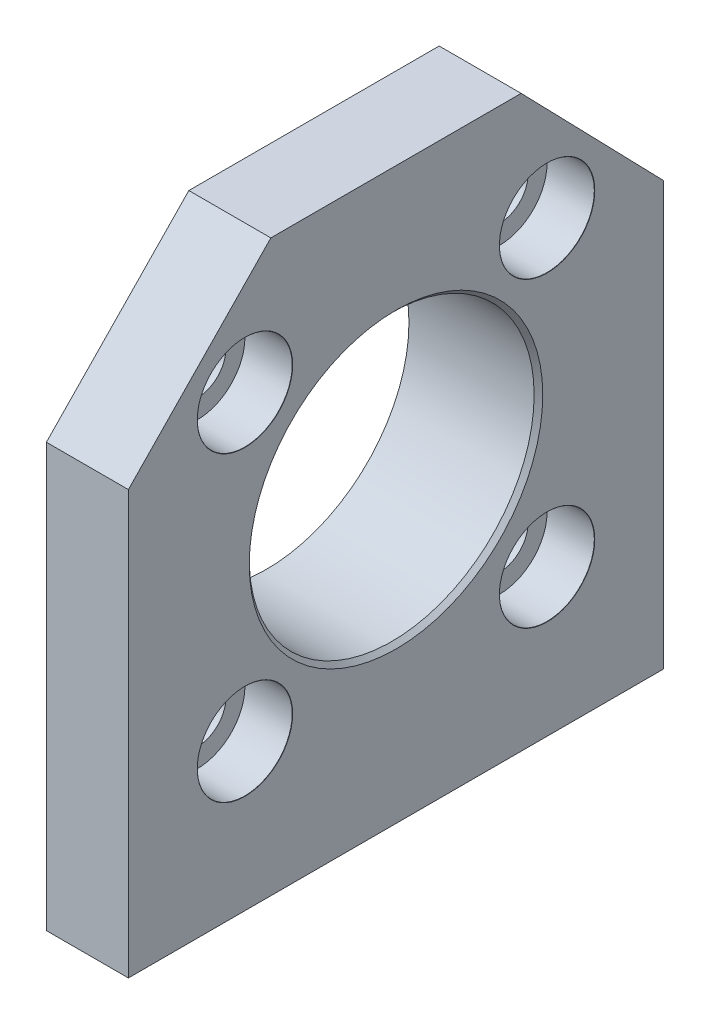
ISO-10303-21;
HEADER;
FILE_DESCRIPTION(('STEP AP214'),'2;1');
FILE_NAME('part.step','',(''),(''),'','','');
FILE_SCHEMA(('AUTOMOTIVE_DESIGN { 1 0 10303 214 1 1 1 1 }'));
ENDSEC;
DATA;
#1=APPLICATION_CONTEXT('core data for automotive mechanical design processes');
#2=APPLICATION_PROTOCOL_DEFINITION('international standard','automotive_design',2000,#1);
#3=PRODUCT_CONTEXT('',#1,'mechanical');
#4=PRODUCT('Part','Part','',(#3));
#5=PRODUCT_RELATED_PRODUCT_CATEGORY('part','',(#4));
#6=PRODUCT_DEFINITION_FORMATION('','',#4);
#7=PRODUCT_DEFINITION_CONTEXT('part definition',#1,'design');
#8=PRODUCT_DEFINITION('design','',#6,#7);
#9=PRODUCT_DEFINITION_SHAPE('','',#8);
#10=(LENGTH_UNIT() NAMED_UNIT(*) SI_UNIT(.MILLI.,.METRE.));
#11=(NAMED_UNIT(*) PLANE_ANGLE_UNIT() SI_UNIT($,.RADIAN.));
#12=(NAMED_UNIT(*) SI_UNIT($,.STERADIAN.) SOLID_ANGLE_UNIT());
#13=UNCERTAINTY_MEASURE_WITH_UNIT(LENGTH_MEASURE(1.E-05),#10,'distance_accuracy_value','');
#14=(GEOMETRIC_REPRESENTATION_CONTEXT(3) GLOBAL_UNCERTAINTY_ASSIGNED_CONTEXT((#13)) GLOBAL_UNIT_ASSIGNED_CONTEXT((#10,
#11,#12)) REPRESENTATION_CONTEXT('',''));
#15=CARTESIAN_POINT('',(0.,0.,0.));
#16=DIRECTION('',(0.,0.,1.));
#17=DIRECTION('',(1.,0.,0.));
#18=AXIS2_PLACEMENT_3D('',#15,#16,#17);
#19=CARTESIAN_POINT('',(-9.5,23.7688195991091,24.4890868596882));
#20=DIRECTION('',(0.,-0.69647537716866,-0.717580691628316));
#21=DIRECTION('',(0.,0.717580691628316,-0.69647537716866));
#22=AXIS2_PLACEMENT_3D('',#19,#20,#21);
#23=PLANE('',#22);
#24=DIRECTION('',(0.,0.717580691628316,-0.69647537716866));
#25=VECTOR('',#24,1.);
#26=CARTESIAN_POINT('',(0.,23.7688195991091,24.4890868596882));
#27=LINE('',#26,#25);
#28=CARTESIAN_POINT('',(0.,49.,0.));
#29=VERTEX_POINT('',#28);
#30=CARTESIAN_POINT('',(0.,66.,-16.5));
#31=VERTEX_POINT('',#30);
#32=EDGE_CURVE('E128',#29,#31,#27,.T.);
#33=ORIENTED_EDGE('',*,*,#32,.T.);
#34=DIRECTION('',(1.,0.,0.));
#35=VECTOR('',#34,1.);
#36=CARTESIAN_POINT('',(-9.5,66.,-16.5));
#37=LINE('',#36,#35);
#38=CARTESIAN_POINT('',(-9.5,66.,-16.5));
#39=VERTEX_POINT('',#38);
#40=EDGE_CURVE('E142',#39,#31,#37,.T.);
#41=ORIENTED_EDGE('',*,*,#40,.F.);
#42=DIRECTION('',(0.,0.717580691628316,-0.69647537716866));
#43=VECTOR('',#42,1.);
#44=CARTESIAN_POINT('',(-9.5,23.7688195991091,24.4890868596882));
#45=LINE('',#44,#43);
#46=CARTESIAN_POINT('',(-9.5,49.,0.));
#47=VERTEX_POINT('',#46);
#48=EDGE_CURVE('E141',#47,#39,#45,.T.);
#49=ORIENTED_EDGE('',*,*,#48,.F.);
#50=DIRECTION('',(1.,0.,0.));
#51=VECTOR('',#50,1.);
#52=CARTESIAN_POINT('',(-9.5,49.,0.));
#53=LINE('',#52,#51);
#54=EDGE_CURVE('E127',#47,#29,#53,.T.);
#55=ORIENTED_EDGE('',*,*,#54,.T.);
#56=EDGE_LOOP('',(#33,#41,#49,#55));
#57=FACE_BOUND('',#56,.T.);
#58=ADVANCED_FACE('F42',(#57),#23,.F.);
#59=CARTESIAN_POINT('',(-9.5,66.,0.));
#60=DIRECTION('',(0.,-1.,0.));
#61=DIRECTION('',(0.,0.,-1.));
#62=AXIS2_PLACEMENT_3D('',#59,#60,#61);
#63=PLANE('',#62);
#64=DIRECTION('',(0.,0.,-1.));
#65=VECTOR('',#64,1.);
#66=CARTESIAN_POINT('',(0.,66.,0.));
#67=LINE('',#66,#65);
#68=CARTESIAN_POINT('',(0.,66.,-45.5));
#69=VERTEX_POINT('',#68);
#70=EDGE_CURVE('E80',#31,#69,#67,.T.);
#71=ORIENTED_EDGE('',*,*,#70,.T.);
#72=DIRECTION('',(1.,0.,0.));
#73=VECTOR('',#72,1.);
#74=CARTESIAN_POINT('',(-9.5,66.,-45.5));
#75=LINE('',#74,#73);
#76=CARTESIAN_POINT('',(-9.5,66.,-45.5));
#77=VERTEX_POINT('',#76);
#78=EDGE_CURVE('E117',#77,#69,#75,.T.);
#79=ORIENTED_EDGE('',*,*,#78,.F.);
#80=DIRECTION('',(0.,0.,-1.));
#81=VECTOR('',#80,1.);
#82=CARTESIAN_POINT('',(-9.5,66.,0.));
#83=LINE('',#82,#81);
#84=EDGE_CURVE('E60',#39,#77,#83,.T.);
#85=ORIENTED_EDGE('',*,*,#84,.F.);
#86=ORIENTED_EDGE('',*,*,#40,.T.);
#87=EDGE_LOOP('',(#71,#79,#85,#86));
#88=FACE_BOUND('',#87,.T.);
#89=ADVANCED_FACE('F167',(#88),#63,.F.);
#90=CARTESIAN_POINT('',(-9.5,54.7550111358575,-56.4142538975501));
#91=DIRECTION('',(0.,-0.69647537716866,0.717580691628316));
#92=DIRECTION('',(0.,-0.717580691628316,-0.69647537716866));
#93=AXIS2_PLACEMENT_3D('',#90,#91,#92);
#94=PLANE('',#93);
#95=DIRECTION('',(0.,-0.717580691628316,-0.69647537716866));
#96=VECTOR('',#95,1.);
#97=CARTESIAN_POINT('',(0.,54.7550111358575,-56.4142538975501));
#98=LINE('',#97,#96);
#99=CARTESIAN_POINT('',(0.,49.,-62.));
#100=VERTEX_POINT('',#99);
#101=EDGE_CURVE('E113',#69,#100,#98,.T.);
#102=ORIENTED_EDGE('',*,*,#101,.T.);
#103=DIRECTION('',(1.,0.,0.));
#104=VECTOR('',#103,1.);
#105=CARTESIAN_POINT('',(-9.5,49.,-62.));
#106=LINE('',#105,#104);
#107=CARTESIAN_POINT('',(-9.5,49.,-62.));
#108=VERTEX_POINT('',#107);
#109=EDGE_CURVE('E111',#108,#100,#106,.T.);
#110=ORIENTED_EDGE('',*,*,#109,.F.);
#111=DIRECTION('',(0.,-0.717580691628316,-0.69647537716866));
#112=VECTOR('',#111,1.);
#113=CARTESIAN_POINT('',(-9.5,54.7550111358575,-56.4142538975501));
#114=LINE('',#113,#112);
#115=EDGE_CURVE('E102',#77,#108,#114,.T.);
#116=ORIENTED_EDGE('',*,*,#115,.F.);
#117=ORIENTED_EDGE('',*,*,#78,.T.);
#118=EDGE_LOOP('',(#102,#110,#116,#117));
#119=FACE_BOUND('',#118,.T.);
#120=ADVANCED_FACE('F112',(#119),#94,.F.);
#121=CARTESIAN_POINT('',(-9.5,0.,-62.));
#122=DIRECTION('',(0.,0.,-1.));
#123=DIRECTION('',(-1.,0.,0.));
#124=AXIS2_PLACEMENT_3D('',#121,#122,#123);
#125=PLANE('',#124);
#126=DIRECTION('',(0.,1.,0.));
#127=VECTOR('',#126,1.);
#128=CARTESIAN_POINT('',(0.,0.,-62.));
#129=LINE('',#128,#127);
#130=CARTESIAN_POINT('',(0.,0.,-62.));
#131=VERTEX_POINT('',#130);
#132=EDGE_CURVE('E137',#131,#100,#129,.T.);
#133=ORIENTED_EDGE('',*,*,#132,.F.);
#134=DIRECTION('',(1.,0.,0.));
#135=VECTOR('',#134,1.);
#136=CARTESIAN_POINT('',(-9.5,0.,-62.));
#137=LINE('',#136,#135);
#138=CARTESIAN_POINT('',(-9.5,0.,-62.));
#139=VERTEX_POINT('',#138);
#140=EDGE_CURVE('E118',#139,#131,#137,.T.);
#141=ORIENTED_EDGE('',*,*,#140,.F.);
#142=DIRECTION('',(0.,1.,0.));
#143=VECTOR('',#142,1.);
#144=CARTESIAN_POINT('',(-9.5,0.,-62.));
#145=LINE('',#144,#143);
#146=EDGE_CURVE('E106',#139,#108,#145,.T.);
#147=ORIENTED_EDGE('',*,*,#146,.T.);
#148=ORIENTED_EDGE('',*,*,#109,.T.);
#149=EDGE_LOOP('',(#133,#141,#147,#148));
#150=FACE_BOUND('',#149,.T.);
#151=ADVANCED_FACE('F120',(#150),#125,.T.);
#152=CARTESIAN_POINT('',(-9.5,0.,0.));
#153=DIRECTION('',(0.,-1.,0.));
#154=DIRECTION('',(0.,0.,-1.));
#155=AXIS2_PLACEMENT_3D('',#152,#153,#154);
#156=PLANE('',#155);
#157=DIRECTION('',(0.,0.,-1.));
#158=VECTOR('',#157,1.);
#159=CARTESIAN_POINT('',(0.,0.,0.));
#160=LINE('',#159,#158);
#161=CARTESIAN_POINT('',(0.,0.,0.));
#162=VERTEX_POINT('',#161);
#163=EDGE_CURVE('E134',#162,#131,#160,.T.);
#164=ORIENTED_EDGE('',*,*,#163,.F.);
#165=DIRECTION('',(1.,0.,0.));
#166=VECTOR('',#165,1.);
#167=CARTESIAN_POINT('',(-9.5,0.,0.));
#168=LINE('',#167,#166);
#169=CARTESIAN_POINT('',(-9.5,0.,0.));
#170=VERTEX_POINT('',#169);
#171=EDGE_CURVE('E147',#170,#162,#168,.T.);
#172=ORIENTED_EDGE('',*,*,#171,.F.);
#173=DIRECTION('',(0.,0.,-1.));
#174=VECTOR('',#173,1.);
#175=CARTESIAN_POINT('',(-9.5,0.,0.));
#176=LINE('',#175,#174);
#177=EDGE_CURVE('E121',#170,#139,#176,.T.);
#178=ORIENTED_EDGE('',*,*,#177,.T.);
#179=ORIENTED_EDGE('',*,*,#140,.T.);
#180=EDGE_LOOP('',(#164,#172,#178,#179));
#181=FACE_BOUND('',#180,.T.);
#182=ADVANCED_FACE('F177',(#181),#156,.T.);
#183=CARTESIAN_POINT('',(-9.5,0.,0.));
#184=DIRECTION('',(0.,0.,-1.));
#185=DIRECTION('',(-1.,0.,0.));
#186=AXIS2_PLACEMENT_3D('',#183,#184,#185);
#187=PLANE('',#186);
#188=DIRECTION('',(0.,1.,0.));
#189=VECTOR('',#188,1.);
#190=CARTESIAN_POINT('',(0.,0.,0.));
#191=LINE('',#190,#189);
#192=EDGE_CURVE('E131',#162,#29,#191,.T.);
#193=ORIENTED_EDGE('',*,*,#192,.T.);
#194=ORIENTED_EDGE('',*,*,#54,.F.);
#195=DIRECTION('',(0.,1.,0.));
#196=VECTOR('',#195,1.);
#197=CARTESIAN_POINT('',(-9.5,0.,0.));
#198=LINE('',#197,#196);
#199=EDGE_CURVE('E92',#170,#47,#198,.T.);
#200=ORIENTED_EDGE('',*,*,#199,.F.);
#201=ORIENTED_EDGE('',*,*,#171,.T.);
#202=EDGE_LOOP('',(#193,#194,#200,#201));
#203=FACE_BOUND('',#202,.T.);
#204=ADVANCED_FACE('F174',(#203),#187,.F.);
#205=CARTESIAN_POINT('',(-9.5,0.,0.));
#206=DIRECTION('',(1.,0.,0.));
#207=DIRECTION('',(0.,0.,-1.));
#208=AXIS2_PLACEMENT_3D('',#205,#206,#207);
#209=PLANE('',#208);
#210=CARTESIAN_POINT('',(-9.5,34.5,-31.));
#211=DIRECTION('',(1.,0.,0.));
#212=DIRECTION('',(0.,0.,-1.));
#213=AXIS2_PLACEMENT_3D('',#210,#211,#212);
#214=CIRCLE('',#213,19.9);
#215=CARTESIAN_POINT('',(-9.5,34.5,-50.9));
#216=VERTEX_POINT('',#215);
#217=EDGE_CURVE('E144',#216,#216,#214,.F.);
#218=ORIENTED_EDGE('',*,*,#217,.F.);
#219=EDGE_LOOP('',(#218));
#220=FACE_BOUND('',#219,.T.);
#221=CARTESIAN_POINT('',(-9.49999999999999,52.,-13.5));
#222=DIRECTION('',(1.,0.,0.));
#223=DIRECTION('',(0.,0.,-1.));
#224=AXIS2_PLACEMENT_3D('',#221,#222,#223);
#225=CIRCLE('',#224,3.3);
#226=CARTESIAN_POINT('',(-9.49999999999999,52.,-16.8));
#227=VERTEX_POINT('',#226);
#228=EDGE_CURVE('E287',#227,#227,#225,.T.);
#229=ORIENTED_EDGE('',*,*,#228,.T.);
#230=EDGE_LOOP('',(#229));
#231=FACE_BOUND('',#230,.T.);
#232=CARTESIAN_POINT('',(-9.49999999999999,52.,-48.5));
#233=DIRECTION('',(1.,0.,0.));
#234=DIRECTION('',(0.,0.,-1.));
#235=AXIS2_PLACEMENT_3D('',#232,#233,#234);
#236=CIRCLE('',#235,3.3);
#237=CARTESIAN_POINT('',(-9.49999999999999,52.,-51.8));
#238=VERTEX_POINT('',#237);
#239=EDGE_CURVE('E302',#238,#238,#236,.T.);
#240=ORIENTED_EDGE('',*,*,#239,.T.);
#241=EDGE_LOOP('',(#240));
#242=FACE_BOUND('',#241,.T.);
#243=CARTESIAN_POINT('',(-9.49999999999999,17.,-48.5));
#244=DIRECTION('',(1.,0.,0.));
#245=DIRECTION('',(0.,0.,-1.));
#246=AXIS2_PLACEMENT_3D('',#243,#244,#245);
#247=CIRCLE('',#246,3.30000000000001);
#248=CARTESIAN_POINT('',(-9.49999999999999,17.,-51.8));
#249=VERTEX_POINT('',#248);
#250=EDGE_CURVE('E317',#249,#249,#247,.T.);
#251=ORIENTED_EDGE('',*,*,#250,.T.);
#252=EDGE_LOOP('',(#251));
#253=FACE_BOUND('',#252,.T.);
#254=CARTESIAN_POINT('',(-9.49999999999999,17.,-13.5));
#255=DIRECTION('',(1.,0.,0.));
#256=DIRECTION('',(0.,0.,-1.));
#257=AXIS2_PLACEMENT_3D('',#254,#255,#256);
#258=CIRCLE('',#257,3.30000000000001);
#259=CARTESIAN_POINT('',(-9.49999999999999,17.,-16.8));
#260=VERTEX_POINT('',#259);
#261=EDGE_CURVE('E132',#260,#260,#258,.T.);
#262=ORIENTED_EDGE('',*,*,#261,.T.);
#263=EDGE_LOOP('',(#262));
#264=FACE_BOUND('',#263,.T.);
#265=ORIENTED_EDGE('',*,*,#48,.T.);
#266=ORIENTED_EDGE('',*,*,#84,.T.);
#267=ORIENTED_EDGE('',*,*,#115,.T.);
#268=ORIENTED_EDGE('',*,*,#146,.F.);
#269=ORIENTED_EDGE('',*,*,#177,.F.);
#270=ORIENTED_EDGE('',*,*,#199,.T.);
#271=EDGE_LOOP('',(#265,#266,#267,#268,#269,#270));
#272=FACE_BOUND('',#271,.T.);
#273=ADVANCED_FACE('F104',(#220,#231,#242,#253,#264,#272),#209,.F.);
#274=CARTESIAN_POINT('',(0.,0.,0.));
#275=DIRECTION('',(1.,0.,0.));
#276=DIRECTION('',(0.,0.,-1.));
#277=AXIS2_PLACEMENT_3D('',#274,#275,#276);
#278=PLANE('',#277);
#279=CARTESIAN_POINT('',(0.,34.5,-31.));
#280=DIRECTION('',(1.,0.,0.));
#281=DIRECTION('',(0.,0.,-1.));
#282=AXIS2_PLACEMENT_3D('',#279,#280,#281);
#283=CIRCLE('',#282,17.);
#284=CARTESIAN_POINT('',(0.,34.5,-48.));
#285=VERTEX_POINT('',#284);
#286=EDGE_CURVE('E11',#285,#285,#283,.F.);
#287=ORIENTED_EDGE('',*,*,#286,.T.);
#288=EDGE_LOOP('',(#287));
#289=FACE_BOUND('',#288,.T.);
#290=CARTESIAN_POINT('',(0.,52.,-13.5));
#291=DIRECTION('',(1.,0.,0.));
#292=DIRECTION('',(0.,0.,-1.));
#293=AXIS2_PLACEMENT_3D('',#290,#291,#292);
#294=CIRCLE('',#293,5.525);
#295=CARTESIAN_POINT('',(0.,52.,-19.025));
#296=VERTEX_POINT('',#295);
#297=EDGE_CURVE('E272',#296,#296,#294,.T.);
#298=ORIENTED_EDGE('',*,*,#297,.F.);
#299=EDGE_LOOP('',(#298));
#300=FACE_BOUND('',#299,.T.);
#301=CARTESIAN_POINT('',(0.,52.,-48.5));
#302=DIRECTION('',(1.,0.,0.));
#303=DIRECTION('',(0.,0.,-1.));
#304=AXIS2_PLACEMENT_3D('',#301,#302,#303);
#305=CIRCLE('',#304,5.525);
#306=CARTESIAN_POINT('',(0.,52.,-54.025));
#307=VERTEX_POINT('',#306);
#308=EDGE_CURVE('E290',#307,#307,#305,.T.);
#309=ORIENTED_EDGE('',*,*,#308,.F.);
#310=EDGE_LOOP('',(#309));
#311=FACE_BOUND('',#310,.T.);
#312=CARTESIAN_POINT('',(0.,17.,-48.5));
#313=DIRECTION('',(1.,0.,0.));
#314=DIRECTION('',(0.,0.,-1.));
#315=AXIS2_PLACEMENT_3D('',#312,#313,#314);
#316=CIRCLE('',#315,5.525);
#317=CARTESIAN_POINT('',(0.,17.,-54.025));
#318=VERTEX_POINT('',#317);
#319=EDGE_CURVE('E305',#318,#318,#316,.T.);
#320=ORIENTED_EDGE('',*,*,#319,.F.);
#321=EDGE_LOOP('',(#320));
#322=FACE_BOUND('',#321,.T.);
#323=CARTESIAN_POINT('',(0.,17.,-13.5));
#324=DIRECTION('',(1.,0.,0.));
#325=DIRECTION('',(0.,0.,-1.));
#326=AXIS2_PLACEMENT_3D('',#323,#324,#325);
#327=CIRCLE('',#326,5.525);
#328=CARTESIAN_POINT('',(0.,17.,-19.025));
#329=VERTEX_POINT('',#328);
#330=EDGE_CURVE('E320',#329,#329,#327,.T.);
#331=ORIENTED_EDGE('',*,*,#330,.F.);
#332=EDGE_LOOP('',(#331));
#333=FACE_BOUND('',#332,.T.);
#334=ORIENTED_EDGE('',*,*,#32,.F.);
#335=ORIENTED_EDGE('',*,*,#192,.F.);
#336=ORIENTED_EDGE('',*,*,#163,.T.);
#337=ORIENTED_EDGE('',*,*,#132,.T.);
#338=ORIENTED_EDGE('',*,*,#101,.F.);
#339=ORIENTED_EDGE('',*,*,#70,.F.);
#340=EDGE_LOOP('',(#334,#335,#336,#337,#338,#339));
#341=FACE_BOUND('',#340,.T.);
#342=ADVANCED_FACE('F186',(#289,#300,#311,#322,#333,#341),#278,.T.);
#343=CARTESIAN_POINT('',(0.,17.,-13.5));
#344=DIRECTION('',(1.,0.,0.));
#345=DIRECTION('',(0.,0.,-1.));
#346=AXIS2_PLACEMENT_3D('',#343,#344,#345);
#347=CYLINDRICAL_SURFACE('',#346,3.3);
#348=ORIENTED_EDGE('',*,*,#261,.F.);
#349=EDGE_LOOP('',(#348));
#350=FACE_BOUND('',#349,.T.);
#351=CARTESIAN_POINT('',(-5.5,17.,-13.5));
#352=DIRECTION('',(1.,0.,0.));
#353=DIRECTION('',(0.,0.,-1.));
#354=AXIS2_PLACEMENT_3D('',#351,#352,#353);
#355=CIRCLE('',#354,3.3);
#356=CARTESIAN_POINT('',(-5.5,17.,-16.8));
#357=VERTEX_POINT('',#356);
#358=EDGE_CURVE('E329',#357,#357,#355,.T.);
#359=ORIENTED_EDGE('',*,*,#358,.T.);
#360=EDGE_LOOP('',(#359));
#361=FACE_BOUND('',#360,.T.);
#362=ADVANCED_FACE('F189',(#350,#361),#347,.F.);
#363=CARTESIAN_POINT('',(-5.5,22.5,-13.5));
#364=DIRECTION('',(-1.,0.,0.));
#365=DIRECTION('',(0.,0.,1.));
#366=AXIS2_PLACEMENT_3D('',#363,#364,#365);
#367=PLANE('',#366);
#368=ORIENTED_EDGE('',*,*,#358,.F.);
#369=EDGE_LOOP('',(#368));
#370=FACE_BOUND('',#369,.T.);
#371=CARTESIAN_POINT('',(-5.5,17.,-13.5));
#372=DIRECTION('',(1.,0.,0.));
#373=DIRECTION('',(0.,0.,-1.));
#374=AXIS2_PLACEMENT_3D('',#371,#372,#373);
#375=CIRCLE('',#374,5.5);
#376=CARTESIAN_POINT('',(-5.5,17.,-19.));
#377=VERTEX_POINT('',#376);
#378=EDGE_CURVE('E326',#377,#377,#375,.T.);
#379=ORIENTED_EDGE('',*,*,#378,.T.);
#380=EDGE_LOOP('',(#379));
#381=FACE_BOUND('',#380,.T.);
#382=ADVANCED_FACE('F196',(#370,#381),#367,.F.);
#383=CARTESIAN_POINT('',(0.,17.,-13.5));
#384=DIRECTION('',(1.,0.,0.));
#385=DIRECTION('',(0.,0.,-1.));
#386=AXIS2_PLACEMENT_3D('',#383,#384,#385);
#387=CYLINDRICAL_SURFACE('',#386,5.5);
#388=ORIENTED_EDGE('',*,*,#378,.F.);
#389=EDGE_LOOP('',(#388));
#390=FACE_BOUND('',#389,.T.);
#391=CARTESIAN_POINT('',(-0.0250000000000033,17.,-13.5));
#392=DIRECTION('',(1.,0.,0.));
#393=DIRECTION('',(0.,0.,-1.));
#394=AXIS2_PLACEMENT_3D('',#391,#392,#393);
#395=CIRCLE('',#394,5.5);
#396=CARTESIAN_POINT('',(-0.0250000000000033,17.,-19.));
#397=VERTEX_POINT('',#396);
#398=EDGE_CURVE('E323',#397,#397,#395,.T.);
#399=ORIENTED_EDGE('',*,*,#398,.T.);
#400=EDGE_LOOP('',(#399));
#401=FACE_BOUND('',#400,.T.);
#402=ADVANCED_FACE('F200',(#390,#401),#387,.F.);
#403=CARTESIAN_POINT('',(0.,17.,-13.5));
#404=DIRECTION('',(1.,0.,0.));
#405=DIRECTION('',(0.,0.,-1.));
#406=AXIS2_PLACEMENT_3D('',#403,#404,#405);
#407=CONICAL_SURFACE('',#406,5.525,0.785398163397466);
#408=ORIENTED_EDGE('',*,*,#398,.F.);
#409=EDGE_LOOP('',(#408));
#410=FACE_BOUND('',#409,.T.);
#411=ORIENTED_EDGE('',*,*,#330,.T.);
#412=EDGE_LOOP('',(#411));
#413=FACE_BOUND('',#412,.T.);
#414=ADVANCED_FACE('F204',(#410,#413),#407,.F.);
#415=CARTESIAN_POINT('',(0.,17.,-48.5));
#416=DIRECTION('',(1.,0.,0.));
#417=DIRECTION('',(0.,0.,-1.));
#418=AXIS2_PLACEMENT_3D('',#415,#416,#417);
#419=CYLINDRICAL_SURFACE('',#418,3.3);
#420=ORIENTED_EDGE('',*,*,#250,.F.);
#421=EDGE_LOOP('',(#420));
#422=FACE_BOUND('',#421,.T.);
#423=CARTESIAN_POINT('',(-5.5,17.,-48.5));
#424=DIRECTION('',(1.,0.,0.));
#425=DIRECTION('',(0.,0.,-1.));
#426=AXIS2_PLACEMENT_3D('',#423,#424,#425);
#427=CIRCLE('',#426,3.3);
#428=CARTESIAN_POINT('',(-5.5,17.,-51.8));
#429=VERTEX_POINT('',#428);
#430=EDGE_CURVE('E314',#429,#429,#427,.T.);
#431=ORIENTED_EDGE('',*,*,#430,.T.);
#432=EDGE_LOOP('',(#431));
#433=FACE_BOUND('',#432,.T.);
#434=ADVANCED_FACE('F208',(#422,#433),#419,.F.);
#435=CARTESIAN_POINT('',(-5.5,22.5,-48.5));
#436=DIRECTION('',(-1.,0.,0.));
#437=DIRECTION('',(0.,0.,1.));
#438=AXIS2_PLACEMENT_3D('',#435,#436,#437);
#439=PLANE('',#438);
#440=ORIENTED_EDGE('',*,*,#430,.F.);
#441=EDGE_LOOP('',(#440));
#442=FACE_BOUND('',#441,.T.);
#443=CARTESIAN_POINT('',(-5.5,17.,-48.5));
#444=DIRECTION('',(1.,0.,0.));
#445=DIRECTION('',(0.,0.,-1.));
#446=AXIS2_PLACEMENT_3D('',#443,#444,#445);
#447=CIRCLE('',#446,5.5);
#448=CARTESIAN_POINT('',(-5.5,17.,-54.));
#449=VERTEX_POINT('',#448);
#450=EDGE_CURVE('E311',#449,#449,#447,.T.);
#451=ORIENTED_EDGE('',*,*,#450,.T.);
#452=EDGE_LOOP('',(#451));
#453=FACE_BOUND('',#452,.T.);
#454=ADVANCED_FACE('F212',(#442,#453),#439,.F.);
#455=CARTESIAN_POINT('',(0.,17.,-48.5));
#456=DIRECTION('',(1.,0.,0.));
#457=DIRECTION('',(0.,0.,-1.));
#458=AXIS2_PLACEMENT_3D('',#455,#456,#457);
#459=CYLINDRICAL_SURFACE('',#458,5.5);
#460=ORIENTED_EDGE('',*,*,#450,.F.);
#461=EDGE_LOOP('',(#460));
#462=FACE_BOUND('',#461,.T.);
#463=CARTESIAN_POINT('',(-0.0250000000000033,17.,-48.5));
#464=DIRECTION('',(1.,0.,0.));
#465=DIRECTION('',(0.,0.,-1.));
#466=AXIS2_PLACEMENT_3D('',#463,#464,#465);
#467=CIRCLE('',#466,5.5);
#468=CARTESIAN_POINT('',(-0.0250000000000033,17.,-54.));
#469=VERTEX_POINT('',#468);
#470=EDGE_CURVE('E308',#469,#469,#467,.T.);
#471=ORIENTED_EDGE('',*,*,#470,.T.);
#472=EDGE_LOOP('',(#471));
#473=FACE_BOUND('',#472,.T.);
#474=ADVANCED_FACE('F216',(#462,#473),#459,.F.);
#475=CARTESIAN_POINT('',(0.,17.,-48.5));
#476=DIRECTION('',(1.,0.,0.));
#477=DIRECTION('',(0.,0.,-1.));
#478=AXIS2_PLACEMENT_3D('',#475,#476,#477);
#479=CONICAL_SURFACE('',#478,5.525,0.785398163397466);
#480=ORIENTED_EDGE('',*,*,#470,.F.);
#481=EDGE_LOOP('',(#480));
#482=FACE_BOUND('',#481,.T.);
#483=ORIENTED_EDGE('',*,*,#319,.T.);
#484=EDGE_LOOP('',(#483));
#485=FACE_BOUND('',#484,.T.);
#486=ADVANCED_FACE('F220',(#482,#485),#479,.F.);
#487=CARTESIAN_POINT('',(0.,52.,-48.5));
#488=DIRECTION('',(1.,0.,0.));
#489=DIRECTION('',(0.,0.,-1.));
#490=AXIS2_PLACEMENT_3D('',#487,#488,#489);
#491=CYLINDRICAL_SURFACE('',#490,3.3);
#492=ORIENTED_EDGE('',*,*,#239,.F.);
#493=EDGE_LOOP('',(#492));
#494=FACE_BOUND('',#493,.T.);
#495=CARTESIAN_POINT('',(-5.5,52.,-48.5));
#496=DIRECTION('',(1.,0.,0.));
#497=DIRECTION('',(0.,0.,-1.));
#498=AXIS2_PLACEMENT_3D('',#495,#496,#497);
#499=CIRCLE('',#498,3.3);
#500=CARTESIAN_POINT('',(-5.5,52.,-51.8));
#501=VERTEX_POINT('',#500);
#502=EDGE_CURVE('E299',#501,#501,#499,.T.);
#503=ORIENTED_EDGE('',*,*,#502,.T.);
#504=EDGE_LOOP('',(#503));
#505=FACE_BOUND('',#504,.T.);
#506=ADVANCED_FACE('F224',(#494,#505),#491,.F.);
#507=CARTESIAN_POINT('',(-5.5,57.5,-48.5));
#508=DIRECTION('',(-1.,0.,0.));
#509=DIRECTION('',(0.,0.,1.));
#510=AXIS2_PLACEMENT_3D('',#507,#508,#509);
#511=PLANE('',#510);
#512=ORIENTED_EDGE('',*,*,#502,.F.);
#513=EDGE_LOOP('',(#512));
#514=FACE_BOUND('',#513,.T.);
#515=CARTESIAN_POINT('',(-5.5,52.,-48.5));
#516=DIRECTION('',(1.,0.,0.));
#517=DIRECTION('',(0.,0.,-1.));
#518=AXIS2_PLACEMENT_3D('',#515,#516,#517);
#519=CIRCLE('',#518,5.5);
#520=CARTESIAN_POINT('',(-5.5,52.,-54.));
#521=VERTEX_POINT('',#520);
#522=EDGE_CURVE('E296',#521,#521,#519,.T.);
#523=ORIENTED_EDGE('',*,*,#522,.T.);
#524=EDGE_LOOP('',(#523));
#525=FACE_BOUND('',#524,.T.);
#526=ADVANCED_FACE('F228',(#514,#525),#511,.F.);
#527=CARTESIAN_POINT('',(0.,52.,-48.5));
#528=DIRECTION('',(1.,0.,0.));
#529=DIRECTION('',(0.,0.,-1.));
#530=AXIS2_PLACEMENT_3D('',#527,#528,#529);
#531=CYLINDRICAL_SURFACE('',#530,5.5);
#532=ORIENTED_EDGE('',*,*,#522,.F.);
#533=EDGE_LOOP('',(#532));
#534=FACE_BOUND('',#533,.T.);
#535=CARTESIAN_POINT('',(-0.0250000000000033,52.,-48.5));
#536=DIRECTION('',(1.,0.,0.));
#537=DIRECTION('',(0.,0.,-1.));
#538=AXIS2_PLACEMENT_3D('',#535,#536,#537);
#539=CIRCLE('',#538,5.5);
#540=CARTESIAN_POINT('',(-0.0250000000000033,52.,-54.));
#541=VERTEX_POINT('',#540);
#542=EDGE_CURVE('E293',#541,#541,#539,.T.);
#543=ORIENTED_EDGE('',*,*,#542,.T.);
#544=EDGE_LOOP('',(#543));
#545=FACE_BOUND('',#544,.T.);
#546=ADVANCED_FACE('F232',(#534,#545),#531,.F.);
#547=CARTESIAN_POINT('',(0.,52.,-48.5));
#548=DIRECTION('',(1.,0.,0.));
#549=DIRECTION('',(0.,0.,-1.));
#550=AXIS2_PLACEMENT_3D('',#547,#548,#549);
#551=CONICAL_SURFACE('',#550,5.525,0.785398163397466);
#552=ORIENTED_EDGE('',*,*,#542,.F.);
#553=EDGE_LOOP('',(#552));
#554=FACE_BOUND('',#553,.T.);
#555=ORIENTED_EDGE('',*,*,#308,.T.);
#556=EDGE_LOOP('',(#555));
#557=FACE_BOUND('',#556,.T.);
#558=ADVANCED_FACE('F236',(#554,#557),#551,.F.);
#559=CARTESIAN_POINT('',(0.,52.,-13.5));
#560=DIRECTION('',(1.,0.,0.));
#561=DIRECTION('',(0.,0.,-1.));
#562=AXIS2_PLACEMENT_3D('',#559,#560,#561);
#563=CYLINDRICAL_SURFACE('',#562,3.3);
#564=ORIENTED_EDGE('',*,*,#228,.F.);
#565=EDGE_LOOP('',(#564));
#566=FACE_BOUND('',#565,.T.);
#567=CARTESIAN_POINT('',(-5.5,52.,-13.5));
#568=DIRECTION('',(1.,0.,0.));
#569=DIRECTION('',(0.,0.,-1.));
#570=AXIS2_PLACEMENT_3D('',#567,#568,#569);
#571=CIRCLE('',#570,3.3);
#572=CARTESIAN_POINT('',(-5.5,52.,-16.8));
#573=VERTEX_POINT('',#572);
#574=EDGE_CURVE('E284',#573,#573,#571,.T.);
#575=ORIENTED_EDGE('',*,*,#574,.T.);
#576=EDGE_LOOP('',(#575));
#577=FACE_BOUND('',#576,.T.);
#578=ADVANCED_FACE('F240',(#566,#577),#563,.F.);
#579=CARTESIAN_POINT('',(-5.5,57.5,-13.5));
#580=DIRECTION('',(-1.,0.,0.));
#581=DIRECTION('',(0.,0.,1.));
#582=AXIS2_PLACEMENT_3D('',#579,#580,#581);
#583=PLANE('',#582);
#584=ORIENTED_EDGE('',*,*,#574,.F.);
#585=EDGE_LOOP('',(#584));
#586=FACE_BOUND('',#585,.T.);
#587=CARTESIAN_POINT('',(-5.5,52.,-13.5));
#588=DIRECTION('',(1.,0.,0.));
#589=DIRECTION('',(0.,0.,-1.));
#590=AXIS2_PLACEMENT_3D('',#587,#588,#589);
#591=CIRCLE('',#590,5.5);
#592=CARTESIAN_POINT('',(-5.5,52.,-19.));
#593=VERTEX_POINT('',#592);
#594=EDGE_CURVE('E281',#593,#593,#591,.T.);
#595=ORIENTED_EDGE('',*,*,#594,.T.);
#596=EDGE_LOOP('',(#595));
#597=FACE_BOUND('',#596,.T.);
#598=ADVANCED_FACE('F244',(#586,#597),#583,.F.);
#599=CARTESIAN_POINT('',(0.,52.,-13.5));
#600=DIRECTION('',(1.,0.,0.));
#601=DIRECTION('',(0.,0.,-1.));
#602=AXIS2_PLACEMENT_3D('',#599,#600,#601);
#603=CYLINDRICAL_SURFACE('',#602,5.5);
#604=ORIENTED_EDGE('',*,*,#594,.F.);
#605=EDGE_LOOP('',(#604));
#606=FACE_BOUND('',#605,.T.);
#607=CARTESIAN_POINT('',(-0.0250000000000033,52.,-13.5));
#608=DIRECTION('',(1.,0.,0.));
#609=DIRECTION('',(0.,0.,-1.));
#610=AXIS2_PLACEMENT_3D('',#607,#608,#609);
#611=CIRCLE('',#610,5.5);
#612=CARTESIAN_POINT('',(-0.0250000000000033,52.,-19.));
#613=VERTEX_POINT('',#612);
#614=EDGE_CURVE('E275',#613,#613,#611,.T.);
#615=ORIENTED_EDGE('',*,*,#614,.T.);
#616=EDGE_LOOP('',(#615));
#617=FACE_BOUND('',#616,.T.);
#618=ADVANCED_FACE('F248',(#606,#617),#603,.F.);
#619=CARTESIAN_POINT('',(0.,52.,-13.5));
#620=DIRECTION('',(1.,0.,0.));
#621=DIRECTION('',(0.,0.,-1.));
#622=AXIS2_PLACEMENT_3D('',#619,#620,#621);
#623=CONICAL_SURFACE('',#622,5.525,0.785398163397466);
#624=ORIENTED_EDGE('',*,*,#614,.F.);
#625=EDGE_LOOP('',(#624));
#626=FACE_BOUND('',#625,.T.);
#627=ORIENTED_EDGE('',*,*,#297,.T.);
#628=EDGE_LOOP('',(#627));
#629=FACE_BOUND('',#628,.T.);
#630=ADVANCED_FACE('F252',(#626,#629),#623,.F.);
#631=CARTESIAN_POINT('',(-15.,34.5,-31.));
#632=DIRECTION('',(1.,0.,0.));
#633=DIRECTION('',(0.,0.,-1.));
#634=AXIS2_PLACEMENT_3D('',#631,#632,#633);
#635=CYLINDRICAL_SURFACE('',#634,19.9);
#636=CARTESIAN_POINT('',(-15.,34.5,-31.));
#637=DIRECTION('',(-1.,0.,0.));
#638=DIRECTION('',(0.,0.,1.));
#639=AXIS2_PLACEMENT_3D('',#636,#637,#638);
#640=CIRCLE('',#639,19.9);
#641=CARTESIAN_POINT('',(-15.,34.5,-11.1));
#642=VERTEX_POINT('',#641);
#643=EDGE_CURVE('E271',#642,#642,#640,.T.);
#644=ORIENTED_EDGE('',*,*,#643,.F.);
#645=EDGE_LOOP('',(#644));
#646=FACE_BOUND('',#645,.T.);
#647=ORIENTED_EDGE('',*,*,#217,.T.);
#648=EDGE_LOOP('',(#647));
#649=FACE_BOUND('',#648,.T.);
#650=ADVANCED_FACE('F256',(#646,#649),#635,.T.);
#651=CARTESIAN_POINT('',(-15.,34.5,-31.));
#652=DIRECTION('',(-1.,0.,0.));
#653=DIRECTION('',(0.,0.,1.));
#654=AXIS2_PLACEMENT_3D('',#651,#652,#653);
#655=PLANE('',#654);
#656=CARTESIAN_POINT('',(-15.,34.5,-31.));
#657=DIRECTION('',(1.,0.,0.));
#658=DIRECTION('',(0.,0.,-1.));
#659=AXIS2_PLACEMENT_3D('',#656,#657,#658);
#660=CIRCLE('',#659,16.5);
#661=CARTESIAN_POINT('',(-15.,34.5,-47.5));
#662=VERTEX_POINT('',#661);
#663=EDGE_CURVE('E268',#662,#662,#660,.T.);
#664=ORIENTED_EDGE('',*,*,#663,.T.);
#665=EDGE_LOOP('',(#664));
#666=FACE_BOUND('',#665,.T.);
#667=ORIENTED_EDGE('',*,*,#643,.T.);
#668=EDGE_LOOP('',(#667));
#669=FACE_BOUND('',#668,.T.);
#670=ADVANCED_FACE('F163',(#666,#669),#655,.T.);
#671=CARTESIAN_POINT('',(-15.,34.5,-31.));
#672=DIRECTION('',(1.,0.,0.));
#673=DIRECTION('',(0.,0.,-1.));
#674=AXIS2_PLACEMENT_3D('',#671,#672,#673);
#675=CYLINDRICAL_SURFACE('',#674,16.5);
#676=CARTESIAN_POINT('',(-0.499999999999987,34.5,-31.));
#677=DIRECTION('',(1.,0.,0.));
#678=DIRECTION('',(0.,0.,-1.));
#679=AXIS2_PLACEMENT_3D('',#676,#677,#678);
#680=CIRCLE('',#679,16.5);
#681=CARTESIAN_POINT('',(-0.499999999999987,34.5,-47.5));
#682=VERTEX_POINT('',#681);
#683=EDGE_CURVE('E52',#682,#682,#680,.T.);
#684=ORIENTED_EDGE('',*,*,#683,.T.);
#685=EDGE_LOOP('',(#684));
#686=FACE_BOUND('',#685,.T.);
#687=ORIENTED_EDGE('',*,*,#663,.F.);
#688=EDGE_LOOP('',(#687));
#689=FACE_BOUND('',#688,.T.);
#690=ADVANCED_FACE('F155',(#686,#689),#675,.F.);
#691=CARTESIAN_POINT('',(-0.499999999999987,34.5,-31.));
#692=DIRECTION('',(1.,0.,0.));
#693=DIRECTION('',(0.,0.,-1.));
#694=AXIS2_PLACEMENT_3D('',#691,#692,#693);
#695=CONICAL_SURFACE('',#694,16.5,0.785398163397462);
#696=ORIENTED_EDGE('',*,*,#286,.F.);
#697=EDGE_LOOP('',(#696));
#698=FACE_BOUND('',#697,.T.);
#699=ORIENTED_EDGE('',*,*,#683,.F.);
#700=EDGE_LOOP('',(#699));
#701=FACE_BOUND('',#700,.T.);
#702=ADVANCED_FACE('F45',(#698,#701),#695,.F.);
#703=CLOSED_SHELL('',(#58,#89,#120,#151,#182,#204,#273,#342,#362,#382,#402,#414,#434,#454,#474,
#486,#506,#526,#546,#558,#578,#598,#618,#630,#650,#670,#690,#702));
#704=MANIFOLD_SOLID_BREP('B2',#703);
#705=ADVANCED_BREP_SHAPE_REPRESENTATION('',(#18,#704),#14);
#706=SHAPE_DEFINITION_REPRESENTATION(#9,#705);
ENDSEC;
END-ISO-10303-21;
